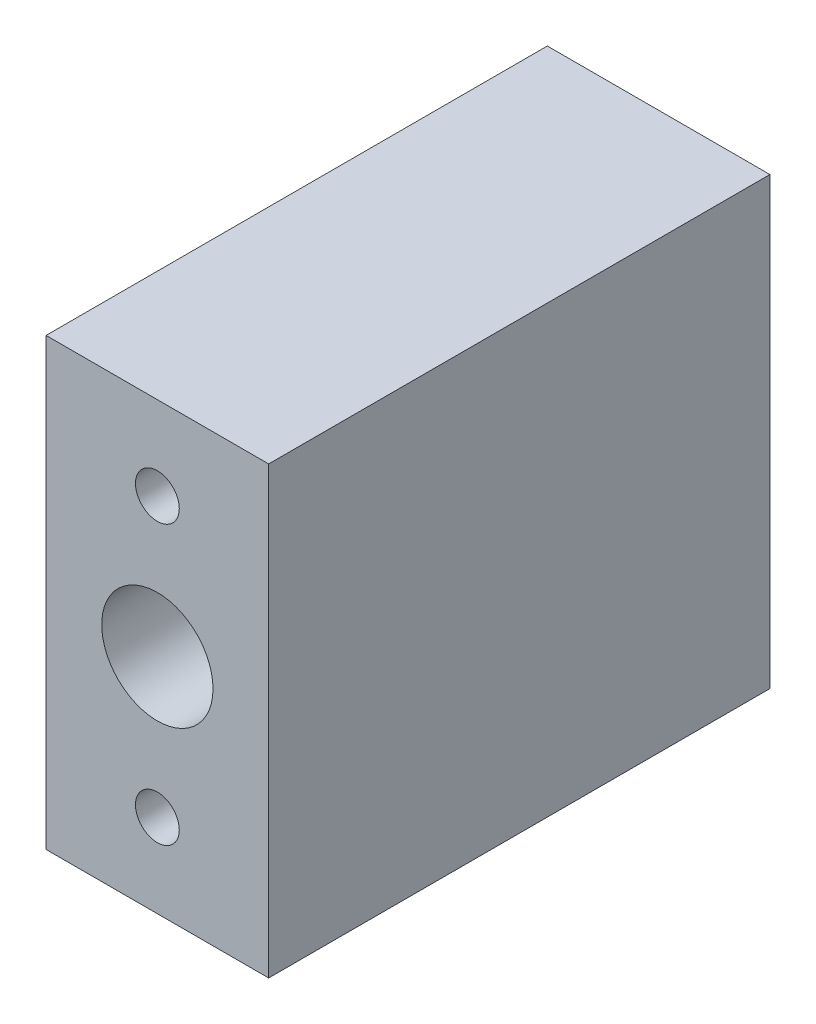
ISO-10303-21;
HEADER;
FILE_DESCRIPTION(('STEP AP214'),'2;1');
FILE_NAME('part.step','',(''),(''),'','','');
FILE_SCHEMA(('AUTOMOTIVE_DESIGN { 1 0 10303 214 1 1 1 1 }'));
ENDSEC;
DATA;
#1=APPLICATION_CONTEXT('core data for automotive mechanical design processes');
#2=APPLICATION_PROTOCOL_DEFINITION('international standard','automotive_design',2000,#1);
#3=PRODUCT_CONTEXT('',#1,'mechanical');
#4=PRODUCT('Part','Part','',(#3));
#5=PRODUCT_RELATED_PRODUCT_CATEGORY('part','',(#4));
#6=PRODUCT_DEFINITION_FORMATION('','',#4);
#7=PRODUCT_DEFINITION_CONTEXT('part definition',#1,'design');
#8=PRODUCT_DEFINITION('design','',#6,#7);
#9=PRODUCT_DEFINITION_SHAPE('','',#8);
#10=(LENGTH_UNIT() NAMED_UNIT(*) SI_UNIT(.MILLI.,.METRE.));
#11=(NAMED_UNIT(*) PLANE_ANGLE_UNIT() SI_UNIT($,.RADIAN.));
#12=(NAMED_UNIT(*) SI_UNIT($,.STERADIAN.) SOLID_ANGLE_UNIT());
#13=UNCERTAINTY_MEASURE_WITH_UNIT(LENGTH_MEASURE(1.E-05),#10,'distance_accuracy_value','');
#14=(GEOMETRIC_REPRESENTATION_CONTEXT(3) GLOBAL_UNCERTAINTY_ASSIGNED_CONTEXT((#13)) GLOBAL_UNIT_ASSIGNED_CONTEXT((#10,
#11,#12)) REPRESENTATION_CONTEXT('',''));
#15=CARTESIAN_POINT('',(0.,0.,0.));
#16=DIRECTION('',(0.,0.,1.));
#17=DIRECTION('',(1.,0.,0.));
#18=AXIS2_PLACEMENT_3D('',#15,#16,#17);
#19=CARTESIAN_POINT('',(-12.7,25.4,0.));
#20=DIRECTION('',(-1.,0.,0.));
#21=DIRECTION('',(0.,0.,1.));
#22=AXIS2_PLACEMENT_3D('',#19,#20,#21);
#23=PLANE('',#22);
#24=DIRECTION('',(0.,0.,-1.));
#25=VECTOR('',#24,1.);
#26=CARTESIAN_POINT('',(-12.7,0.,0.));
#27=LINE('',#26,#25);
#28=CARTESIAN_POINT('',(-12.7,0.,0.));
#29=VERTEX_POINT('',#28);
#30=CARTESIAN_POINT('',(-12.7,0.,-28.5986));
#31=VERTEX_POINT('',#30);
#32=EDGE_CURVE('E99',#29,#31,#27,.T.);
#33=ORIENTED_EDGE('',*,*,#32,.F.);
#34=DIRECTION('',(0.,-1.,0.));
#35=VECTOR('',#34,1.);
#36=CARTESIAN_POINT('',(-12.7,25.4,0.));
#37=LINE('',#36,#35);
#38=CARTESIAN_POINT('',(-12.7,25.4,0.));
#39=VERTEX_POINT('',#38);
#40=EDGE_CURVE('E11',#39,#29,#37,.T.);
#41=ORIENTED_EDGE('',*,*,#40,.F.);
#42=DIRECTION('',(0.,0.,-1.));
#43=VECTOR('',#42,1.);
#44=CARTESIAN_POINT('',(-12.7,25.4,0.));
#45=LINE('',#44,#43);
#46=CARTESIAN_POINT('',(-12.7,25.4,-28.5986));
#47=VERTEX_POINT('',#46);
#48=EDGE_CURVE('E92',#39,#47,#45,.T.);
#49=ORIENTED_EDGE('',*,*,#48,.T.);
#50=DIRECTION('',(0.,-1.,0.));
#51=VECTOR('',#50,1.);
#52=CARTESIAN_POINT('',(-12.7,25.4,-28.5986));
#53=LINE('',#52,#51);
#54=EDGE_CURVE('E73',#47,#31,#53,.T.);
#55=ORIENTED_EDGE('',*,*,#54,.T.);
#56=EDGE_LOOP('',(#33,#41,#49,#55));
#57=FACE_BOUND('',#56,.T.);
#58=ADVANCED_FACE('F35',(#57),#23,.T.);
#59=CARTESIAN_POINT('',(0.,25.4,0.));
#60=DIRECTION('',(0.,0.,1.));
#61=DIRECTION('',(1.,0.,0.));
#62=AXIS2_PLACEMENT_3D('',#59,#60,#61);
#63=PLANE('',#62);
#64=CARTESIAN_POINT('',(-6.35,20.6375,0.));
#65=DIRECTION('',(0.,0.,1.));
#66=DIRECTION('',(1.,0.,0.));
#67=AXIS2_PLACEMENT_3D('',#64,#65,#66);
#68=CIRCLE('',#67,1.25);
#69=CARTESIAN_POINT('',(-5.1,20.6375,0.));
#70=VERTEX_POINT('',#69);
#71=EDGE_CURVE('E148',#70,#70,#68,.T.);
#72=ORIENTED_EDGE('',*,*,#71,.F.);
#73=EDGE_LOOP('',(#72));
#74=FACE_BOUND('',#73,.T.);
#75=CARTESIAN_POINT('',(-6.35,4.7625,0.));
#76=DIRECTION('',(0.,0.,1.));
#77=DIRECTION('',(1.,0.,0.));
#78=AXIS2_PLACEMENT_3D('',#75,#76,#77);
#79=CIRCLE('',#78,1.25);
#80=CARTESIAN_POINT('',(-5.1,4.7625,0.));
#81=VERTEX_POINT('',#80);
#82=EDGE_CURVE('E153',#81,#81,#79,.T.);
#83=ORIENTED_EDGE('',*,*,#82,.F.);
#84=EDGE_LOOP('',(#83));
#85=FACE_BOUND('',#84,.T.);
#86=CARTESIAN_POINT('',(-6.35,12.7,0.));
#87=DIRECTION('',(0.,0.,1.));
#88=DIRECTION('',(1.,0.,0.));
#89=AXIS2_PLACEMENT_3D('',#86,#87,#88);
#90=CIRCLE('',#89,3.175);
#91=CARTESIAN_POINT('',(-3.175,12.7,0.));
#92=VERTEX_POINT('',#91);
#93=EDGE_CURVE('E160',#92,#92,#90,.T.);
#94=ORIENTED_EDGE('',*,*,#93,.F.);
#95=EDGE_LOOP('',(#94));
#96=FACE_BOUND('',#95,.T.);
#97=DIRECTION('',(-1.,0.,0.));
#98=VECTOR('',#97,1.);
#99=CARTESIAN_POINT('',(0.,0.,0.));
#100=LINE('',#99,#98);
#101=CARTESIAN_POINT('',(0.,0.,0.));
#102=VERTEX_POINT('',#101);
#103=EDGE_CURVE('E86',#102,#29,#100,.T.);
#104=ORIENTED_EDGE('',*,*,#103,.F.);
#105=DIRECTION('',(0.,-1.,0.));
#106=VECTOR('',#105,1.);
#107=CARTESIAN_POINT('',(0.,25.4,0.));
#108=LINE('',#107,#106);
#109=CARTESIAN_POINT('',(0.,25.4,0.));
#110=VERTEX_POINT('',#109);
#111=EDGE_CURVE('E43',#110,#102,#108,.T.);
#112=ORIENTED_EDGE('',*,*,#111,.F.);
#113=DIRECTION('',(-1.,0.,0.));
#114=VECTOR('',#113,1.);
#115=CARTESIAN_POINT('',(0.,25.4,0.));
#116=LINE('',#115,#114);
#117=EDGE_CURVE('E84',#110,#39,#116,.T.);
#118=ORIENTED_EDGE('',*,*,#117,.T.);
#119=ORIENTED_EDGE('',*,*,#40,.T.);
#120=EDGE_LOOP('',(#104,#112,#118,#119));
#121=FACE_BOUND('',#120,.T.);
#122=ADVANCED_FACE('F82',(#74,#85,#96,#121),#63,.T.);
#123=CARTESIAN_POINT('',(0.,25.4,0.));
#124=DIRECTION('',(-1.,0.,0.));
#125=DIRECTION('',(0.,0.,1.));
#126=AXIS2_PLACEMENT_3D('',#123,#124,#125);
#127=PLANE('',#126);
#128=DIRECTION('',(0.,0.,-1.));
#129=VECTOR('',#128,1.);
#130=CARTESIAN_POINT('',(0.,0.,0.));
#131=LINE('',#130,#129);
#132=CARTESIAN_POINT('',(0.,0.,-28.5986));
#133=VERTEX_POINT('',#132);
#134=EDGE_CURVE('E66',#102,#133,#131,.T.);
#135=ORIENTED_EDGE('',*,*,#134,.T.);
#136=DIRECTION('',(0.,-1.,0.));
#137=VECTOR('',#136,1.);
#138=CARTESIAN_POINT('',(0.,25.4,-28.5986));
#139=LINE('',#138,#137);
#140=CARTESIAN_POINT('',(0.,25.4,-28.5986));
#141=VERTEX_POINT('',#140);
#142=EDGE_CURVE('E87',#141,#133,#139,.T.);
#143=ORIENTED_EDGE('',*,*,#142,.F.);
#144=DIRECTION('',(0.,0.,-1.));
#145=VECTOR('',#144,1.);
#146=CARTESIAN_POINT('',(0.,25.4,0.));
#147=LINE('',#146,#145);
#148=EDGE_CURVE('E88',#110,#141,#147,.T.);
#149=ORIENTED_EDGE('',*,*,#148,.F.);
#150=ORIENTED_EDGE('',*,*,#111,.T.);
#151=EDGE_LOOP('',(#135,#143,#149,#150));
#152=FACE_BOUND('',#151,.T.);
#153=ADVANCED_FACE('F89',(#152),#127,.F.);
#154=CARTESIAN_POINT('',(0.,25.4,-28.5986));
#155=DIRECTION('',(0.,0.,1.));
#156=DIRECTION('',(1.,0.,0.));
#157=AXIS2_PLACEMENT_3D('',#154,#155,#156);
#158=PLANE('',#157);
#159=CARTESIAN_POINT('',(-6.35,20.6375,-28.5986));
#160=DIRECTION('',(0.,0.,1.));
#161=DIRECTION('',(1.,0.,0.));
#162=AXIS2_PLACEMENT_3D('',#159,#160,#161);
#163=CIRCLE('',#162,1.25);
#164=CARTESIAN_POINT('',(-5.1,20.6375,-28.5986));
#165=VERTEX_POINT('',#164);
#166=EDGE_CURVE('E102',#165,#165,#163,.T.);
#167=ORIENTED_EDGE('',*,*,#166,.T.);
#168=EDGE_LOOP('',(#167));
#169=FACE_BOUND('',#168,.T.);
#170=CARTESIAN_POINT('',(-6.35,4.7625,-28.5986));
#171=DIRECTION('',(0.,0.,1.));
#172=DIRECTION('',(1.,0.,0.));
#173=AXIS2_PLACEMENT_3D('',#170,#171,#172);
#174=CIRCLE('',#173,1.25);
#175=CARTESIAN_POINT('',(-5.1,4.7625,-28.5986));
#176=VERTEX_POINT('',#175);
#177=EDGE_CURVE('E149',#176,#176,#174,.T.);
#178=ORIENTED_EDGE('',*,*,#177,.T.);
#179=EDGE_LOOP('',(#178));
#180=FACE_BOUND('',#179,.T.);
#181=CARTESIAN_POINT('',(-6.35,12.7,-28.5986));
#182=DIRECTION('',(0.,0.,1.));
#183=DIRECTION('',(1.,0.,0.));
#184=AXIS2_PLACEMENT_3D('',#181,#182,#183);
#185=CIRCLE('',#184,3.175);
#186=CARTESIAN_POINT('',(-3.175,12.7,-28.5986));
#187=VERTEX_POINT('',#186);
#188=EDGE_CURVE('E158',#187,#187,#185,.T.);
#189=ORIENTED_EDGE('',*,*,#188,.T.);
#190=EDGE_LOOP('',(#189));
#191=FACE_BOUND('',#190,.T.);
#192=DIRECTION('',(-1.,0.,0.));
#193=VECTOR('',#192,1.);
#194=CARTESIAN_POINT('',(0.,0.,-28.5986));
#195=LINE('',#194,#193);
#196=EDGE_CURVE('E94',#133,#31,#195,.T.);
#197=ORIENTED_EDGE('',*,*,#196,.T.);
#198=ORIENTED_EDGE('',*,*,#54,.F.);
#199=DIRECTION('',(-1.,0.,0.));
#200=VECTOR('',#199,1.);
#201=CARTESIAN_POINT('',(0.,25.4,-28.5986));
#202=LINE('',#201,#200);
#203=EDGE_CURVE('E51',#141,#47,#202,.T.);
#204=ORIENTED_EDGE('',*,*,#203,.F.);
#205=ORIENTED_EDGE('',*,*,#142,.T.);
#206=EDGE_LOOP('',(#197,#198,#204,#205));
#207=FACE_BOUND('',#206,.T.);
#208=ADVANCED_FACE('F109',(#169,#180,#191,#207),#158,.F.);
#209=CARTESIAN_POINT('',(0.,25.4,0.));
#210=DIRECTION('',(0.,1.,0.));
#211=DIRECTION('',(0.,0.,1.));
#212=AXIS2_PLACEMENT_3D('',#209,#210,#211);
#213=PLANE('',#212);
#214=ORIENTED_EDGE('',*,*,#48,.F.);
#215=ORIENTED_EDGE('',*,*,#117,.F.);
#216=ORIENTED_EDGE('',*,*,#148,.T.);
#217=ORIENTED_EDGE('',*,*,#203,.T.);
#218=EDGE_LOOP('',(#214,#215,#216,#217));
#219=FACE_BOUND('',#218,.T.);
#220=ADVANCED_FACE('F91',(#219),#213,.T.);
#221=CARTESIAN_POINT('',(0.,0.,0.));
#222=DIRECTION('',(0.,1.,0.));
#223=DIRECTION('',(0.,0.,1.));
#224=AXIS2_PLACEMENT_3D('',#221,#222,#223);
#225=PLANE('',#224);
#226=ORIENTED_EDGE('',*,*,#32,.T.);
#227=ORIENTED_EDGE('',*,*,#196,.F.);
#228=ORIENTED_EDGE('',*,*,#134,.F.);
#229=ORIENTED_EDGE('',*,*,#103,.T.);
#230=EDGE_LOOP('',(#226,#227,#228,#229));
#231=FACE_BOUND('',#230,.T.);
#232=ADVANCED_FACE('F111',(#231),#225,.F.);
#233=CARTESIAN_POINT('',(-6.35,12.7,-28.5986));
#234=DIRECTION('',(0.,0.,1.));
#235=DIRECTION('',(1.,0.,0.));
#236=AXIS2_PLACEMENT_3D('',#233,#234,#235);
#237=CYLINDRICAL_SURFACE('',#236,3.175);
#238=ORIENTED_EDGE('',*,*,#188,.F.);
#239=EDGE_LOOP('',(#238));
#240=FACE_BOUND('',#239,.T.);
#241=ORIENTED_EDGE('',*,*,#93,.T.);
#242=EDGE_LOOP('',(#241));
#243=FACE_BOUND('',#242,.T.);
#244=ADVANCED_FACE('F129',(#240,#243),#237,.F.);
#245=CARTESIAN_POINT('',(-6.35,4.7625,-28.5986));
#246=DIRECTION('',(0.,0.,1.));
#247=DIRECTION('',(1.,0.,0.));
#248=AXIS2_PLACEMENT_3D('',#245,#246,#247);
#249=CYLINDRICAL_SURFACE('',#248,1.25);
#250=ORIENTED_EDGE('',*,*,#177,.F.);
#251=EDGE_LOOP('',(#250));
#252=FACE_BOUND('',#251,.T.);
#253=ORIENTED_EDGE('',*,*,#82,.T.);
#254=EDGE_LOOP('',(#253));
#255=FACE_BOUND('',#254,.T.);
#256=ADVANCED_FACE('F134',(#252,#255),#249,.F.);
#257=CARTESIAN_POINT('',(-6.35,20.6375,-28.5986));
#258=DIRECTION('',(0.,0.,1.));
#259=DIRECTION('',(1.,0.,0.));
#260=AXIS2_PLACEMENT_3D('',#257,#258,#259);
#261=CYLINDRICAL_SURFACE('',#260,1.25);
#262=ORIENTED_EDGE('',*,*,#166,.F.);
#263=EDGE_LOOP('',(#262));
#264=FACE_BOUND('',#263,.T.);
#265=ORIENTED_EDGE('',*,*,#71,.T.);
#266=EDGE_LOOP('',(#265));
#267=FACE_BOUND('',#266,.T.);
#268=ADVANCED_FACE('F138',(#264,#267),#261,.F.);
#269=CLOSED_SHELL('',(#58,#122,#153,#208,#220,#232,#244,#256,#268));
#270=MANIFOLD_SOLID_BREP('B2',#269);
#271=ADVANCED_BREP_SHAPE_REPRESENTATION('',(#18,#270),#14);
#272=SHAPE_DEFINITION_REPRESENTATION(#9,#271);
ENDSEC;
END-ISO-10303-21;
